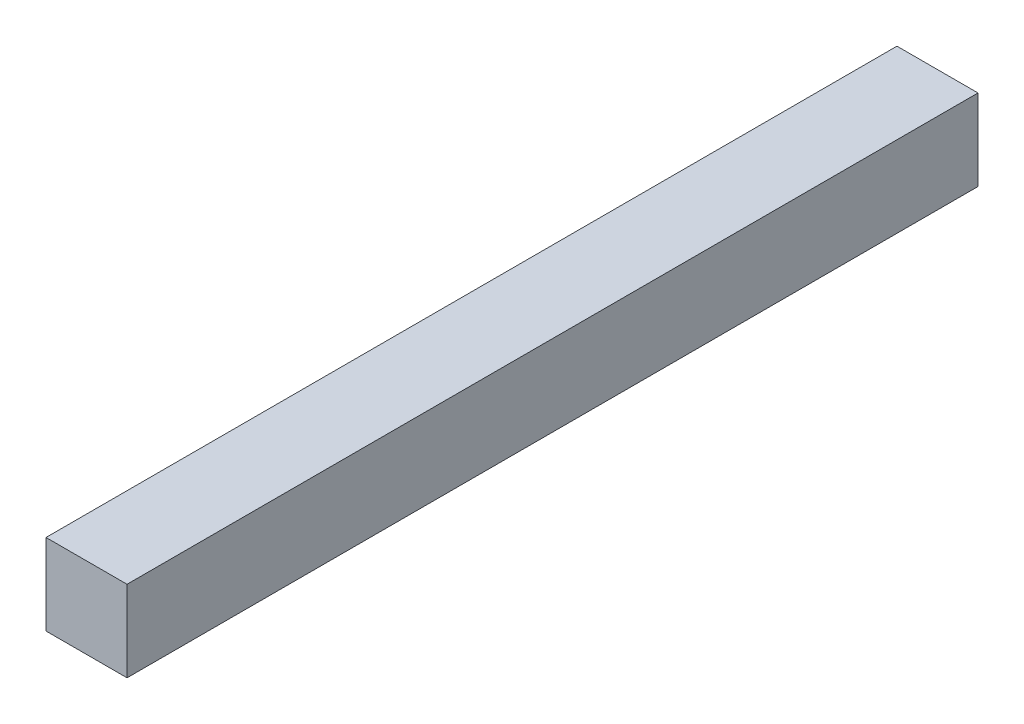
ISO-10303-21;
HEADER;
FILE_DESCRIPTION(('STEP AP214'),'2;1');
FILE_NAME('part.step','',(''),(''),'','','');
FILE_SCHEMA(('AUTOMOTIVE_DESIGN { 1 0 10303 214 1 1 1 1 }'));
ENDSEC;
DATA;
#1=APPLICATION_CONTEXT('core data for automotive mechanical design processes');
#2=APPLICATION_PROTOCOL_DEFINITION('international standard','automotive_design',2000,#1);
#3=PRODUCT_CONTEXT('',#1,'mechanical');
#4=PRODUCT('Part','Part','',(#3));
#5=PRODUCT_RELATED_PRODUCT_CATEGORY('part','',(#4));
#6=PRODUCT_DEFINITION_FORMATION('','',#4);
#7=PRODUCT_DEFINITION_CONTEXT('part definition',#1,'design');
#8=PRODUCT_DEFINITION('design','',#6,#7);
#9=PRODUCT_DEFINITION_SHAPE('','',#8);
#10=(LENGTH_UNIT() NAMED_UNIT(*) SI_UNIT(.MILLI.,.METRE.));
#11=(NAMED_UNIT(*) PLANE_ANGLE_UNIT() SI_UNIT($,.RADIAN.));
#12=(NAMED_UNIT(*) SI_UNIT($,.STERADIAN.) SOLID_ANGLE_UNIT());
#13=UNCERTAINTY_MEASURE_WITH_UNIT(LENGTH_MEASURE(1.E-05),#10,'distance_accuracy_value','');
#14=(GEOMETRIC_REPRESENTATION_CONTEXT(3) GLOBAL_UNCERTAINTY_ASSIGNED_CONTEXT((#13)) GLOBAL_UNIT_ASSIGNED_CONTEXT((#10,
#11,#12)) REPRESENTATION_CONTEXT('',''));
#15=CARTESIAN_POINT('',(0.,0.,0.));
#16=DIRECTION('',(0.,0.,1.));
#17=DIRECTION('',(1.,0.,0.));
#18=AXIS2_PLACEMENT_3D('',#15,#16,#17);
#19=CARTESIAN_POINT('',(-275.02538071066,93.8071065989848,420.));
#20=DIRECTION('',(1.,0.,0.));
#21=DIRECTION('',(0.,1.,0.));
#22=AXIS2_PLACEMENT_3D('',#19,#20,#21);
#23=PLANE('',#22);
#24=DIRECTION('',(0.,-1.,0.));
#25=VECTOR('',#24,1.);
#26=CARTESIAN_POINT('',(-275.02538071066,93.8071065989848,0.));
#27=LINE('',#26,#25);
#28=CARTESIAN_POINT('',(-275.02538071066,93.8071065989848,0.));
#29=VERTEX_POINT('',#28);
#30=CARTESIAN_POINT('',(-275.02538071066,53.8071065989848,0.));
#31=VERTEX_POINT('',#30);
#32=EDGE_CURVE('E96',#29,#31,#27,.T.);
#33=ORIENTED_EDGE('',*,*,#32,.T.);
#34=DIRECTION('',(0.,0.,-1.));
#35=VECTOR('',#34,1.);
#36=CARTESIAN_POINT('',(-275.02538071066,53.8071065989848,420.));
#37=LINE('',#36,#35);
#38=CARTESIAN_POINT('',(-275.02538071066,53.8071065989848,420.));
#39=VERTEX_POINT('',#38);
#40=EDGE_CURVE('E11',#39,#31,#37,.T.);
#41=ORIENTED_EDGE('',*,*,#40,.F.);
#42=DIRECTION('',(0.,-1.,0.));
#43=VECTOR('',#42,1.);
#44=CARTESIAN_POINT('',(-275.02538071066,93.8071065989848,420.));
#45=LINE('',#44,#43);
#46=CARTESIAN_POINT('',(-275.02538071066,93.8071065989848,420.));
#47=VERTEX_POINT('',#46);
#48=EDGE_CURVE('E84',#47,#39,#45,.T.);
#49=ORIENTED_EDGE('',*,*,#48,.F.);
#50=DIRECTION('',(0.,0.,-1.));
#51=VECTOR('',#50,1.);
#52=CARTESIAN_POINT('',(-275.02538071066,93.8071065989848,420.));
#53=LINE('',#52,#51);
#54=EDGE_CURVE('E92',#47,#29,#53,.T.);
#55=ORIENTED_EDGE('',*,*,#54,.T.);
#56=EDGE_LOOP('',(#33,#41,#49,#55));
#57=FACE_BOUND('',#56,.T.);
#58=ADVANCED_FACE('F33',(#57),#23,.F.);
#59=CARTESIAN_POINT('',(-275.02538071066,53.8071065989848,420.));
#60=DIRECTION('',(0.,1.,0.));
#61=DIRECTION('',(0.,0.,1.));
#62=AXIS2_PLACEMENT_3D('',#59,#60,#61);
#63=PLANE('',#62);
#64=DIRECTION('',(1.,0.,0.));
#65=VECTOR('',#64,1.);
#66=CARTESIAN_POINT('',(-275.02538071066,53.8071065989848,0.));
#67=LINE('',#66,#65);
#68=CARTESIAN_POINT('',(-235.02538071066,53.8071065989848,0.));
#69=VERTEX_POINT('',#68);
#70=EDGE_CURVE('E88',#31,#69,#67,.T.);
#71=ORIENTED_EDGE('',*,*,#70,.T.);
#72=DIRECTION('',(0.,0.,-1.));
#73=VECTOR('',#72,1.);
#74=CARTESIAN_POINT('',(-235.02538071066,53.8071065989848,420.));
#75=LINE('',#74,#73);
#76=CARTESIAN_POINT('',(-235.02538071066,53.8071065989848,420.));
#77=VERTEX_POINT('',#76);
#78=EDGE_CURVE('E41',#77,#69,#75,.T.);
#79=ORIENTED_EDGE('',*,*,#78,.F.);
#80=DIRECTION('',(1.,0.,0.));
#81=VECTOR('',#80,1.);
#82=CARTESIAN_POINT('',(-275.02538071066,53.8071065989848,420.));
#83=LINE('',#82,#81);
#84=EDGE_CURVE('E79',#39,#77,#83,.T.);
#85=ORIENTED_EDGE('',*,*,#84,.F.);
#86=ORIENTED_EDGE('',*,*,#40,.T.);
#87=EDGE_LOOP('',(#71,#79,#85,#86));
#88=FACE_BOUND('',#87,.T.);
#89=ADVANCED_FACE('F87',(#88),#63,.F.);
#90=CARTESIAN_POINT('',(-235.02538071066,93.8071065989848,420.));
#91=DIRECTION('',(-1.,0.,0.));
#92=DIRECTION('',(0.,-1.,0.));
#93=AXIS2_PLACEMENT_3D('',#90,#91,#92);
#94=PLANE('',#93);
#95=DIRECTION('',(0.,1.,0.));
#96=VECTOR('',#95,1.);
#97=CARTESIAN_POINT('',(-235.02538071066,93.8071065989848,0.));
#98=LINE('',#97,#96);
#99=CARTESIAN_POINT('',(-235.02538071066,93.8071065989848,0.));
#100=VERTEX_POINT('',#99);
#101=EDGE_CURVE('E66',#69,#100,#98,.T.);
#102=ORIENTED_EDGE('',*,*,#101,.T.);
#103=DIRECTION('',(0.,0.,-1.));
#104=VECTOR('',#103,1.);
#105=CARTESIAN_POINT('',(-235.02538071066,93.8071065989848,420.));
#106=LINE('',#105,#104);
#107=CARTESIAN_POINT('',(-235.02538071066,93.8071065989848,420.));
#108=VERTEX_POINT('',#107);
#109=EDGE_CURVE('E89',#108,#100,#106,.T.);
#110=ORIENTED_EDGE('',*,*,#109,.F.);
#111=DIRECTION('',(0.,1.,0.));
#112=VECTOR('',#111,1.);
#113=CARTESIAN_POINT('',(-235.02538071066,93.8071065989848,420.));
#114=LINE('',#113,#112);
#115=EDGE_CURVE('E82',#77,#108,#114,.T.);
#116=ORIENTED_EDGE('',*,*,#115,.F.);
#117=ORIENTED_EDGE('',*,*,#78,.T.);
#118=EDGE_LOOP('',(#102,#110,#116,#117));
#119=FACE_BOUND('',#118,.T.);
#120=ADVANCED_FACE('F90',(#119),#94,.F.);
#121=CARTESIAN_POINT('',(-275.02538071066,93.8071065989848,420.));
#122=DIRECTION('',(0.,-1.,0.));
#123=DIRECTION('',(0.,0.,-1.));
#124=AXIS2_PLACEMENT_3D('',#121,#122,#123);
#125=PLANE('',#124);
#126=DIRECTION('',(-1.,0.,0.));
#127=VECTOR('',#126,1.);
#128=CARTESIAN_POINT('',(-275.02538071066,93.8071065989848,0.));
#129=LINE('',#128,#127);
#130=EDGE_CURVE('E72',#100,#29,#129,.T.);
#131=ORIENTED_EDGE('',*,*,#130,.T.);
#132=ORIENTED_EDGE('',*,*,#54,.F.);
#133=DIRECTION('',(-1.,0.,0.));
#134=VECTOR('',#133,1.);
#135=CARTESIAN_POINT('',(-275.02538071066,93.8071065989848,420.));
#136=LINE('',#135,#134);
#137=EDGE_CURVE('E49',#108,#47,#136,.T.);
#138=ORIENTED_EDGE('',*,*,#137,.F.);
#139=ORIENTED_EDGE('',*,*,#109,.T.);
#140=EDGE_LOOP('',(#131,#132,#138,#139));
#141=FACE_BOUND('',#140,.T.);
#142=ADVANCED_FACE('F103',(#141),#125,.F.);
#143=CARTESIAN_POINT('',(0.,0.,420.));
#144=DIRECTION('',(0.,0.,1.));
#145=DIRECTION('',(1.,0.,0.));
#146=AXIS2_PLACEMENT_3D('',#143,#144,#145);
#147=PLANE('',#146);
#148=ORIENTED_EDGE('',*,*,#48,.T.);
#149=ORIENTED_EDGE('',*,*,#84,.T.);
#150=ORIENTED_EDGE('',*,*,#115,.T.);
#151=ORIENTED_EDGE('',*,*,#137,.T.);
#152=EDGE_LOOP('',(#148,#149,#150,#151));
#153=FACE_BOUND('',#152,.T.);
#154=ADVANCED_FACE('F80',(#153),#147,.T.);
#155=CARTESIAN_POINT('',(0.,0.,0.));
#156=DIRECTION('',(0.,0.,1.));
#157=DIRECTION('',(1.,0.,0.));
#158=AXIS2_PLACEMENT_3D('',#155,#156,#157);
#159=PLANE('',#158);
#160=ORIENTED_EDGE('',*,*,#32,.F.);
#161=ORIENTED_EDGE('',*,*,#130,.F.);
#162=ORIENTED_EDGE('',*,*,#101,.F.);
#163=ORIENTED_EDGE('',*,*,#70,.F.);
#164=EDGE_LOOP('',(#160,#161,#162,#163));
#165=FACE_BOUND('',#164,.T.);
#166=ADVANCED_FACE('F106',(#165),#159,.F.);
#167=CLOSED_SHELL('',(#58,#89,#120,#142,#154,#166));
#168=MANIFOLD_SOLID_BREP('B2',#167);
#169=ADVANCED_BREP_SHAPE_REPRESENTATION('',(#18,#168),#14);
#170=SHAPE_DEFINITION_REPRESENTATION(#9,#169);
ENDSEC;
END-ISO-10303-21;
